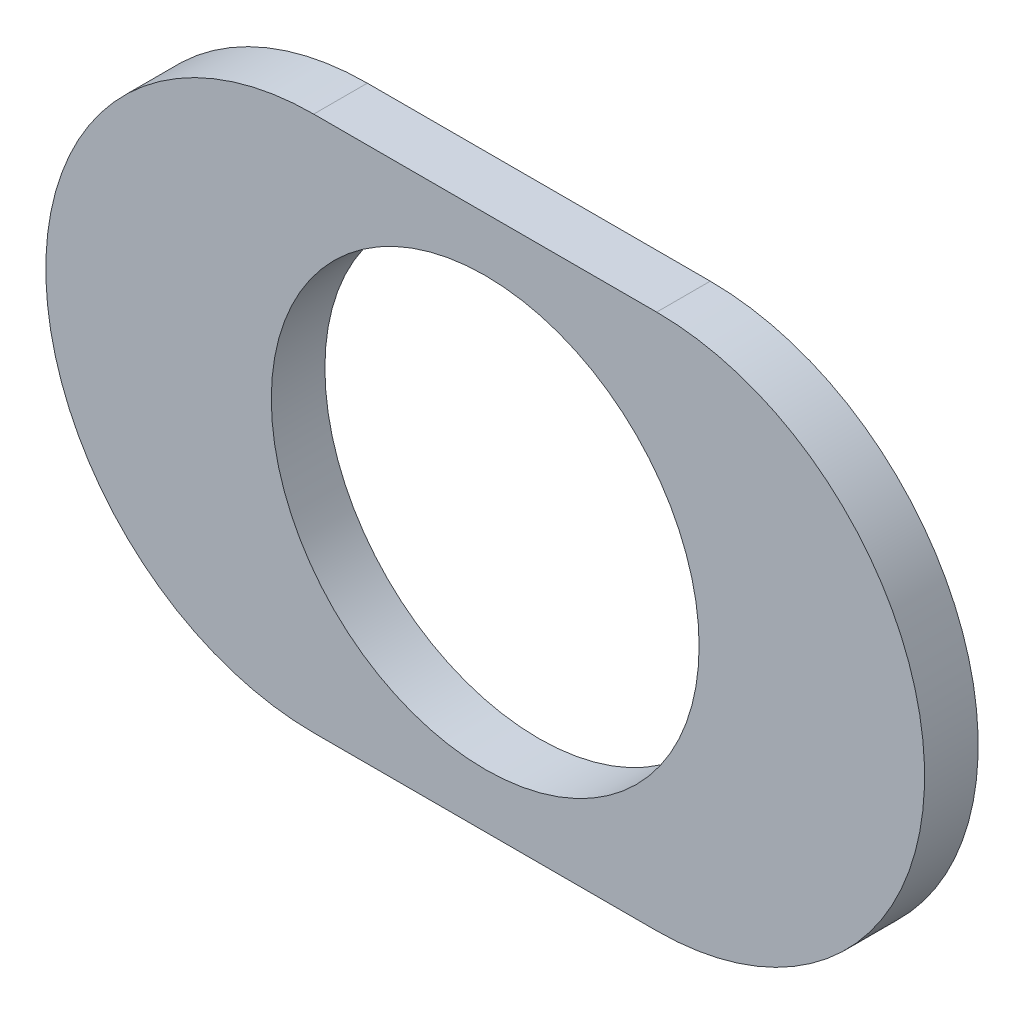
ISO-10303-21;
HEADER;
FILE_DESCRIPTION(('STEP AP214'),'2;1');
FILE_NAME('part.step','',(''),(''),'','','');
FILE_SCHEMA(('AUTOMOTIVE_DESIGN { 1 0 10303 214 1 1 1 1 }'));
ENDSEC;
DATA;
#1=APPLICATION_CONTEXT('core data for automotive mechanical design processes');
#2=APPLICATION_PROTOCOL_DEFINITION('international standard','automotive_design',2000,#1);
#3=PRODUCT_CONTEXT('',#1,'mechanical');
#4=PRODUCT('Part','Part','',(#3));
#5=PRODUCT_RELATED_PRODUCT_CATEGORY('part','',(#4));
#6=PRODUCT_DEFINITION_FORMATION('','',#4);
#7=PRODUCT_DEFINITION_CONTEXT('part definition',#1,'design');
#8=PRODUCT_DEFINITION('design','',#6,#7);
#9=PRODUCT_DEFINITION_SHAPE('','',#8);
#10=(LENGTH_UNIT() NAMED_UNIT(*) SI_UNIT(.MILLI.,.METRE.));
#11=(NAMED_UNIT(*) PLANE_ANGLE_UNIT() SI_UNIT($,.RADIAN.));
#12=(NAMED_UNIT(*) SI_UNIT($,.STERADIAN.) SOLID_ANGLE_UNIT());
#13=UNCERTAINTY_MEASURE_WITH_UNIT(LENGTH_MEASURE(1.E-05),#10,'distance_accuracy_value','');
#14=(GEOMETRIC_REPRESENTATION_CONTEXT(3) GLOBAL_UNCERTAINTY_ASSIGNED_CONTEXT((#13)) GLOBAL_UNIT_ASSIGNED_CONTEXT((#10,
#11,#12)) REPRESENTATION_CONTEXT('',''));
#15=CARTESIAN_POINT('',(0.,0.,0.));
#16=DIRECTION('',(0.,0.,1.));
#17=DIRECTION('',(1.,0.,0.));
#18=AXIS2_PLACEMENT_3D('',#15,#16,#17);
#19=CARTESIAN_POINT('',(5.08,0.,0.79375));
#20=DIRECTION('',(0.,0.,1.));
#21=DIRECTION('',(1.,0.,0.));
#22=AXIS2_PLACEMENT_3D('',#19,#20,#21);
#23=PLANE('',#22);
#24=CARTESIAN_POINT('',(5.08,0.,0.79375));
#25=DIRECTION('',(0.,0.,1.));
#26=DIRECTION('',(1.,0.,0.));
#27=AXIS2_PLACEMENT_3D('',#24,#25,#26);
#28=CIRCLE('',#27,7.9375);
#29=CARTESIAN_POINT('',(5.08,-7.9375,0.79375));
#30=VERTEX_POINT('',#29);
#31=CARTESIAN_POINT('',(5.08,7.9375,0.79375));
#32=VERTEX_POINT('',#31);
#33=EDGE_CURVE('E108',#30,#32,#28,.T.);
#34=ORIENTED_EDGE('',*,*,#33,.T.);
#35=DIRECTION('',(-1.,0.,0.));
#36=VECTOR('',#35,1.);
#37=CARTESIAN_POINT('',(5.08,7.9375,0.79375));
#38=LINE('',#37,#36);
#39=CARTESIAN_POINT('',(-5.08,7.9375,0.79375));
#40=VERTEX_POINT('',#39);
#41=EDGE_CURVE('E103',#32,#40,#38,.T.);
#42=ORIENTED_EDGE('',*,*,#41,.T.);
#43=CARTESIAN_POINT('',(-5.08,0.,0.79375));
#44=DIRECTION('',(0.,0.,1.));
#45=DIRECTION('',(1.,0.,0.));
#46=AXIS2_PLACEMENT_3D('',#43,#44,#45);
#47=CIRCLE('',#46,7.9375);
#48=CARTESIAN_POINT('',(-5.08,-7.9375,0.79375));
#49=VERTEX_POINT('',#48);
#50=EDGE_CURVE('E106',#40,#49,#47,.T.);
#51=ORIENTED_EDGE('',*,*,#50,.T.);
#52=DIRECTION('',(1.,0.,0.));
#53=VECTOR('',#52,1.);
#54=CARTESIAN_POINT('',(5.08,-7.9375,0.79375));
#55=LINE('',#54,#53);
#56=EDGE_CURVE('E73',#49,#30,#55,.T.);
#57=ORIENTED_EDGE('',*,*,#56,.T.);
#58=EDGE_LOOP('',(#34,#42,#51,#57));
#59=FACE_BOUND('',#58,.T.);
#60=CARTESIAN_POINT('',(0.,0.,0.79375));
#61=DIRECTION('',(0.,0.,1.));
#62=DIRECTION('',(1.,0.,0.));
#63=AXIS2_PLACEMENT_3D('',#60,#61,#62);
#64=CIRCLE('',#63,6.3373);
#65=CARTESIAN_POINT('',(6.3373,0.,0.79375));
#66=VERTEX_POINT('',#65);
#67=EDGE_CURVE('E129',#66,#66,#64,.T.);
#68=ORIENTED_EDGE('',*,*,#67,.F.);
#69=EDGE_LOOP('',(#68));
#70=FACE_BOUND('',#69,.T.);
#71=ADVANCED_FACE('F55',(#59,#70),#23,.T.);
#72=CARTESIAN_POINT('',(5.08,0.,-0.79375));
#73=DIRECTION('',(0.,0.,1.));
#74=DIRECTION('',(1.,0.,0.));
#75=AXIS2_PLACEMENT_3D('',#72,#73,#74);
#76=PLANE('',#75);
#77=CARTESIAN_POINT('',(5.08,0.,-0.79375));
#78=DIRECTION('',(0.,0.,1.));
#79=DIRECTION('',(1.,0.,0.));
#80=AXIS2_PLACEMENT_3D('',#77,#78,#79);
#81=CIRCLE('',#80,7.9375);
#82=CARTESIAN_POINT('',(5.08,-7.9375,-0.79375));
#83=VERTEX_POINT('',#82);
#84=CARTESIAN_POINT('',(5.08,7.9375,-0.79375));
#85=VERTEX_POINT('',#84);
#86=EDGE_CURVE('E125',#83,#85,#81,.T.);
#87=ORIENTED_EDGE('',*,*,#86,.F.);
#88=DIRECTION('',(1.,0.,0.));
#89=VECTOR('',#88,1.);
#90=CARTESIAN_POINT('',(5.08,-7.9375,-0.79375));
#91=LINE('',#90,#89);
#92=CARTESIAN_POINT('',(-5.08,-7.9375,-0.79375));
#93=VERTEX_POINT('',#92);
#94=EDGE_CURVE('E96',#93,#83,#91,.T.);
#95=ORIENTED_EDGE('',*,*,#94,.F.);
#96=CARTESIAN_POINT('',(-5.08,0.,-0.79375));
#97=DIRECTION('',(0.,0.,1.));
#98=DIRECTION('',(1.,0.,0.));
#99=AXIS2_PLACEMENT_3D('',#96,#97,#98);
#100=CIRCLE('',#99,7.9375);
#101=CARTESIAN_POINT('',(-5.08,7.9375,-0.79375));
#102=VERTEX_POINT('',#101);
#103=EDGE_CURVE('E90',#102,#93,#100,.T.);
#104=ORIENTED_EDGE('',*,*,#103,.F.);
#105=DIRECTION('',(-1.,0.,0.));
#106=VECTOR('',#105,1.);
#107=CARTESIAN_POINT('',(5.08,7.9375,-0.79375));
#108=LINE('',#107,#106);
#109=EDGE_CURVE('E113',#85,#102,#108,.T.);
#110=ORIENTED_EDGE('',*,*,#109,.F.);
#111=EDGE_LOOP('',(#87,#95,#104,#110));
#112=FACE_BOUND('',#111,.T.);
#113=CARTESIAN_POINT('',(0.,0.,-0.79375));
#114=DIRECTION('',(0.,0.,1.));
#115=DIRECTION('',(1.,0.,0.));
#116=AXIS2_PLACEMENT_3D('',#113,#114,#115);
#117=CIRCLE('',#116,6.3373);
#118=CARTESIAN_POINT('',(6.3373,0.,-0.79375));
#119=VERTEX_POINT('',#118);
#120=EDGE_CURVE('E149',#119,#119,#117,.T.);
#121=ORIENTED_EDGE('',*,*,#120,.T.);
#122=EDGE_LOOP('',(#121));
#123=FACE_BOUND('',#122,.T.);
#124=ADVANCED_FACE('F143',(#112,#123),#76,.F.);
#125=CARTESIAN_POINT('',(5.08,0.,0.79375));
#126=DIRECTION('',(0.,0.,-1.));
#127=DIRECTION('',(-1.,0.,0.));
#128=AXIS2_PLACEMENT_3D('',#125,#126,#127);
#129=CYLINDRICAL_SURFACE('',#128,7.9375);
#130=ORIENTED_EDGE('',*,*,#86,.T.);
#131=DIRECTION('',(0.,0.,-1.));
#132=VECTOR('',#131,1.);
#133=CARTESIAN_POINT('',(5.08,7.9375,0.79375));
#134=LINE('',#133,#132);
#135=EDGE_CURVE('E13',#32,#85,#134,.T.);
#136=ORIENTED_EDGE('',*,*,#135,.F.);
#137=ORIENTED_EDGE('',*,*,#33,.F.);
#138=DIRECTION('',(0.,0.,-1.));
#139=VECTOR('',#138,1.);
#140=CARTESIAN_POINT('',(5.08,-7.9375,0.79375));
#141=LINE('',#140,#139);
#142=EDGE_CURVE('E121',#30,#83,#141,.T.);
#143=ORIENTED_EDGE('',*,*,#142,.T.);
#144=EDGE_LOOP('',(#130,#136,#137,#143));
#145=FACE_BOUND('',#144,.T.);
#146=ADVANCED_FACE('F57',(#145),#129,.T.);
#147=CARTESIAN_POINT('',(5.08,7.9375,0.79375));
#148=DIRECTION('',(0.,-1.,0.));
#149=DIRECTION('',(1.,0.,0.));
#150=AXIS2_PLACEMENT_3D('',#147,#148,#149);
#151=PLANE('',#150);
#152=ORIENTED_EDGE('',*,*,#109,.T.);
#153=DIRECTION('',(0.,0.,-1.));
#154=VECTOR('',#153,1.);
#155=CARTESIAN_POINT('',(-5.08,7.9375,0.79375));
#156=LINE('',#155,#154);
#157=EDGE_CURVE('E65',#40,#102,#156,.T.);
#158=ORIENTED_EDGE('',*,*,#157,.F.);
#159=ORIENTED_EDGE('',*,*,#41,.F.);
#160=ORIENTED_EDGE('',*,*,#135,.T.);
#161=EDGE_LOOP('',(#152,#158,#159,#160));
#162=FACE_BOUND('',#161,.T.);
#163=ADVANCED_FACE('F112',(#162),#151,.F.);
#164=CARTESIAN_POINT('',(-5.08,0.,0.79375));
#165=DIRECTION('',(0.,0.,-1.));
#166=DIRECTION('',(-1.,0.,0.));
#167=AXIS2_PLACEMENT_3D('',#164,#165,#166);
#168=CYLINDRICAL_SURFACE('',#167,7.9375);
#169=ORIENTED_EDGE('',*,*,#103,.T.);
#170=DIRECTION('',(0.,0.,-1.));
#171=VECTOR('',#170,1.);
#172=CARTESIAN_POINT('',(-5.08,-7.9375,0.79375));
#173=LINE('',#172,#171);
#174=EDGE_CURVE('E115',#49,#93,#173,.T.);
#175=ORIENTED_EDGE('',*,*,#174,.F.);
#176=ORIENTED_EDGE('',*,*,#50,.F.);
#177=ORIENTED_EDGE('',*,*,#157,.T.);
#178=EDGE_LOOP('',(#169,#175,#176,#177));
#179=FACE_BOUND('',#178,.T.);
#180=ADVANCED_FACE('F116',(#179),#168,.T.);
#181=CARTESIAN_POINT('',(5.08,-7.9375,0.79375));
#182=DIRECTION('',(0.,1.,0.));
#183=DIRECTION('',(-1.,0.,0.));
#184=AXIS2_PLACEMENT_3D('',#181,#182,#183);
#185=PLANE('',#184);
#186=ORIENTED_EDGE('',*,*,#94,.T.);
#187=ORIENTED_EDGE('',*,*,#142,.F.);
#188=ORIENTED_EDGE('',*,*,#56,.F.);
#189=ORIENTED_EDGE('',*,*,#174,.T.);
#190=EDGE_LOOP('',(#186,#187,#188,#189));
#191=FACE_BOUND('',#190,.T.);
#192=ADVANCED_FACE('F140',(#191),#185,.F.);
#193=CARTESIAN_POINT('',(0.,0.,0.79375));
#194=DIRECTION('',(0.,0.,-1.));
#195=DIRECTION('',(-1.,0.,0.));
#196=AXIS2_PLACEMENT_3D('',#193,#194,#195);
#197=CYLINDRICAL_SURFACE('',#196,6.3373);
#198=ORIENTED_EDGE('',*,*,#67,.T.);
#199=EDGE_LOOP('',(#198));
#200=FACE_BOUND('',#199,.T.);
#201=ORIENTED_EDGE('',*,*,#120,.F.);
#202=EDGE_LOOP('',(#201));
#203=FACE_BOUND('',#202,.T.);
#204=ADVANCED_FACE('F158',(#200,#203),#197,.F.);
#205=CLOSED_SHELL('',(#71,#124,#146,#163,#180,#192,#204));
#206=MANIFOLD_SOLID_BREP('B2',#205);
#207=ADVANCED_BREP_SHAPE_REPRESENTATION('',(#18,#206),#14);
#208=SHAPE_DEFINITION_REPRESENTATION(#9,#207);
ENDSEC;
END-ISO-10303-21;
